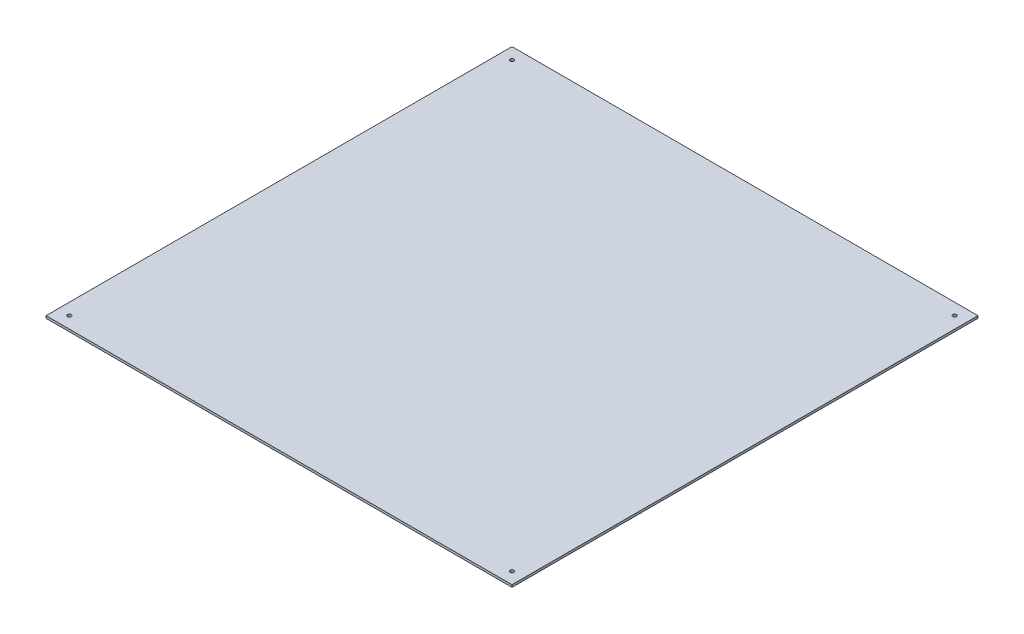
ISO-10303-21;
HEADER;
FILE_DESCRIPTION(('STEP AP214'),'2;1');
FILE_NAME('part.step','',(''),(''),'','','');
FILE_SCHEMA(('AUTOMOTIVE_DESIGN { 1 0 10303 214 1 1 1 1 }'));
ENDSEC;
DATA;
#1=APPLICATION_CONTEXT('core data for automotive mechanical design processes');
#2=APPLICATION_PROTOCOL_DEFINITION('international standard','automotive_design',2000,#1);
#3=PRODUCT_CONTEXT('',#1,'mechanical');
#4=PRODUCT('Part','Part','',(#3));
#5=PRODUCT_RELATED_PRODUCT_CATEGORY('part','',(#4));
#6=PRODUCT_DEFINITION_FORMATION('','',#4);
#7=PRODUCT_DEFINITION_CONTEXT('part definition',#1,'design');
#8=PRODUCT_DEFINITION('design','',#6,#7);
#9=PRODUCT_DEFINITION_SHAPE('','',#8);
#10=(LENGTH_UNIT() NAMED_UNIT(*) SI_UNIT(.MILLI.,.METRE.));
#11=(NAMED_UNIT(*) PLANE_ANGLE_UNIT() SI_UNIT($,.RADIAN.));
#12=(NAMED_UNIT(*) SI_UNIT($,.STERADIAN.) SOLID_ANGLE_UNIT());
#13=UNCERTAINTY_MEASURE_WITH_UNIT(LENGTH_MEASURE(1.E-05),#10,'distance_accuracy_value','');
#14=(GEOMETRIC_REPRESENTATION_CONTEXT(3) GLOBAL_UNCERTAINTY_ASSIGNED_CONTEXT((#13)) GLOBAL_UNIT_ASSIGNED_CONTEXT((#10,
#11,#12)) REPRESENTATION_CONTEXT('',''));
#15=CARTESIAN_POINT('',(0.,0.,0.));
#16=DIRECTION('',(0.,0.,1.));
#17=DIRECTION('',(1.,0.,0.));
#18=AXIS2_PLACEMENT_3D('',#15,#16,#17);
#19=CARTESIAN_POINT('',(-567.961165048544,5.,-366.990291262135));
#20=DIRECTION('',(1.,0.,0.));
#21=DIRECTION('',(0.,0.,-1.));
#22=AXIS2_PLACEMENT_3D('',#19,#20,#21);
#23=PLANE('',#22);
#24=DIRECTION('',(0.,0.,1.));
#25=VECTOR('',#24,1.);
#26=CARTESIAN_POINT('',(-567.961165048544,0.,-366.990291262135));
#27=LINE('',#26,#25);
#28=CARTESIAN_POINT('',(-567.961165048544,0.,-366.990291262135));
#29=VERTEX_POINT('',#28);
#30=CARTESIAN_POINT('',(-567.961165048543,0.,633.009708737865));
#31=VERTEX_POINT('',#30);
#32=EDGE_CURVE('E101',#29,#31,#27,.T.);
#33=ORIENTED_EDGE('',*,*,#32,.T.);
#34=DIRECTION('',(0.,-1.,0.));
#35=VECTOR('',#34,1.);
#36=CARTESIAN_POINT('',(-567.961165048543,5.,633.009708737865));
#37=LINE('',#36,#35);
#38=CARTESIAN_POINT('',(-567.961165048543,5.,633.009708737865));
#39=VERTEX_POINT('',#38);
#40=EDGE_CURVE('E11',#39,#31,#37,.T.);
#41=ORIENTED_EDGE('',*,*,#40,.F.);
#42=DIRECTION('',(0.,0.,1.));
#43=VECTOR('',#42,1.);
#44=CARTESIAN_POINT('',(-567.961165048544,5.,-366.990291262135));
#45=LINE('',#44,#43);
#46=CARTESIAN_POINT('',(-567.961165048544,5.,-366.990291262135));
#47=VERTEX_POINT('',#46);
#48=EDGE_CURVE('E88',#47,#39,#45,.T.);
#49=ORIENTED_EDGE('',*,*,#48,.F.);
#50=DIRECTION('',(0.,-1.,0.));
#51=VECTOR('',#50,1.);
#52=CARTESIAN_POINT('',(-567.961165048544,5.,-366.990291262135));
#53=LINE('',#52,#51);
#54=EDGE_CURVE('E97',#47,#29,#53,.T.);
#55=ORIENTED_EDGE('',*,*,#54,.T.);
#56=EDGE_LOOP('',(#33,#41,#49,#55));
#57=FACE_BOUND('',#56,.T.);
#58=ADVANCED_FACE('F35',(#57),#23,.F.);
#59=CARTESIAN_POINT('',(-567.961165048543,5.,633.009708737865));
#60=DIRECTION('',(0.,0.,-1.));
#61=DIRECTION('',(-1.,0.,0.));
#62=AXIS2_PLACEMENT_3D('',#59,#60,#61);
#63=PLANE('',#62);
#64=DIRECTION('',(1.,0.,0.));
#65=VECTOR('',#64,1.);
#66=CARTESIAN_POINT('',(-567.961165048543,0.,633.009708737865));
#67=LINE('',#66,#65);
#68=CARTESIAN_POINT('',(432.038834951456,0.,633.009708737865));
#69=VERTEX_POINT('',#68);
#70=EDGE_CURVE('E92',#31,#69,#67,.T.);
#71=ORIENTED_EDGE('',*,*,#70,.T.);
#72=DIRECTION('',(0.,-1.,0.));
#73=VECTOR('',#72,1.);
#74=CARTESIAN_POINT('',(432.038834951456,5.,633.009708737865));
#75=LINE('',#74,#73);
#76=CARTESIAN_POINT('',(432.038834951456,5.,633.009708737865));
#77=VERTEX_POINT('',#76);
#78=EDGE_CURVE('E44',#77,#69,#75,.T.);
#79=ORIENTED_EDGE('',*,*,#78,.F.);
#80=DIRECTION('',(1.,0.,0.));
#81=VECTOR('',#80,1.);
#82=CARTESIAN_POINT('',(-567.961165048543,5.,633.009708737865));
#83=LINE('',#82,#81);
#84=EDGE_CURVE('E83',#39,#77,#83,.T.);
#85=ORIENTED_EDGE('',*,*,#84,.F.);
#86=ORIENTED_EDGE('',*,*,#40,.T.);
#87=EDGE_LOOP('',(#71,#79,#85,#86));
#88=FACE_BOUND('',#87,.T.);
#89=ADVANCED_FACE('F91',(#88),#63,.F.);
#90=CARTESIAN_POINT('',(432.038834951456,5.,-366.990291262135));
#91=DIRECTION('',(-1.,0.,0.));
#92=DIRECTION('',(0.,0.,1.));
#93=AXIS2_PLACEMENT_3D('',#90,#91,#92);
#94=PLANE('',#93);
#95=DIRECTION('',(0.,0.,-1.));
#96=VECTOR('',#95,1.);
#97=CARTESIAN_POINT('',(432.038834951456,0.,-366.990291262135));
#98=LINE('',#97,#96);
#99=CARTESIAN_POINT('',(432.038834951456,0.,-366.990291262135));
#100=VERTEX_POINT('',#99);
#101=EDGE_CURVE('E70',#69,#100,#98,.T.);
#102=ORIENTED_EDGE('',*,*,#101,.T.);
#103=DIRECTION('',(0.,-1.,0.));
#104=VECTOR('',#103,1.);
#105=CARTESIAN_POINT('',(432.038834951456,5.,-366.990291262135));
#106=LINE('',#105,#104);
#107=CARTESIAN_POINT('',(432.038834951456,5.,-366.990291262135));
#108=VERTEX_POINT('',#107);
#109=EDGE_CURVE('E93',#108,#100,#106,.T.);
#110=ORIENTED_EDGE('',*,*,#109,.F.);
#111=DIRECTION('',(0.,0.,-1.));
#112=VECTOR('',#111,1.);
#113=CARTESIAN_POINT('',(432.038834951456,5.,-366.990291262135));
#114=LINE('',#113,#112);
#115=EDGE_CURVE('E86',#77,#108,#114,.T.);
#116=ORIENTED_EDGE('',*,*,#115,.F.);
#117=ORIENTED_EDGE('',*,*,#78,.T.);
#118=EDGE_LOOP('',(#102,#110,#116,#117));
#119=FACE_BOUND('',#118,.T.);
#120=ADVANCED_FACE('F95',(#119),#94,.F.);
#121=CARTESIAN_POINT('',(-567.961165048544,5.,-366.990291262135));
#122=DIRECTION('',(0.,0.,1.));
#123=DIRECTION('',(1.,0.,0.));
#124=AXIS2_PLACEMENT_3D('',#121,#122,#123);
#125=PLANE('',#124);
#126=DIRECTION('',(-1.,0.,0.));
#127=VECTOR('',#126,1.);
#128=CARTESIAN_POINT('',(-567.961165048544,0.,-366.990291262135));
#129=LINE('',#128,#127);
#130=EDGE_CURVE('E76',#100,#29,#129,.T.);
#131=ORIENTED_EDGE('',*,*,#130,.T.);
#132=ORIENTED_EDGE('',*,*,#54,.F.);
#133=DIRECTION('',(-1.,0.,0.));
#134=VECTOR('',#133,1.);
#135=CARTESIAN_POINT('',(-567.961165048544,5.,-366.990291262135));
#136=LINE('',#135,#134);
#137=EDGE_CURVE('E53',#108,#47,#136,.T.);
#138=ORIENTED_EDGE('',*,*,#137,.F.);
#139=ORIENTED_EDGE('',*,*,#109,.T.);
#140=EDGE_LOOP('',(#131,#132,#138,#139));
#141=FACE_BOUND('',#140,.T.);
#142=ADVANCED_FACE('F158',(#141),#125,.F.);
#143=CARTESIAN_POINT('',(0.,5.,0.));
#144=DIRECTION('',(0.,1.,0.));
#145=DIRECTION('',(0.,0.,1.));
#146=AXIS2_PLACEMENT_3D('',#143,#144,#145);
#147=PLANE('',#146);
#148=CARTESIAN_POINT('',(407.038834951456,5.,-341.990291262135));
#149=DIRECTION('',(0.,1.,0.));
#150=DIRECTION('',(0.,0.,1.));
#151=AXIS2_PLACEMENT_3D('',#148,#149,#150);
#152=CIRCLE('',#151,4.);
#153=CARTESIAN_POINT('',(407.038834951456,5.,-337.990291262135));
#154=VERTEX_POINT('',#153);
#155=EDGE_CURVE('E126',#154,#154,#152,.T.);
#156=ORIENTED_EDGE('',*,*,#155,.F.);
#157=EDGE_LOOP('',(#156));
#158=FACE_BOUND('',#157,.T.);
#159=CARTESIAN_POINT('',(-542.961165048544,5.,-341.990291262135));
#160=DIRECTION('',(0.,1.,0.));
#161=DIRECTION('',(0.,0.,1.));
#162=AXIS2_PLACEMENT_3D('',#159,#160,#161);
#163=CIRCLE('',#162,4.);
#164=CARTESIAN_POINT('',(-542.961165048544,5.,-337.990291262135));
#165=VERTEX_POINT('',#164);
#166=EDGE_CURVE('E116',#165,#165,#163,.T.);
#167=ORIENTED_EDGE('',*,*,#166,.F.);
#168=EDGE_LOOP('',(#167));
#169=FACE_BOUND('',#168,.T.);
#170=CARTESIAN_POINT('',(-542.961165048544,5.,608.009708737865));
#171=DIRECTION('',(0.,1.,0.));
#172=DIRECTION('',(0.,0.,1.));
#173=AXIS2_PLACEMENT_3D('',#170,#171,#172);
#174=CIRCLE('',#173,4.);
#175=CARTESIAN_POINT('',(-542.961165048544,5.,612.009708737865));
#176=VERTEX_POINT('',#175);
#177=EDGE_CURVE('E113',#176,#176,#174,.T.);
#178=ORIENTED_EDGE('',*,*,#177,.F.);
#179=EDGE_LOOP('',(#178));
#180=FACE_BOUND('',#179,.T.);
#181=CARTESIAN_POINT('',(407.038834951456,5.,608.009708737865));
#182=DIRECTION('',(0.,1.,0.));
#183=DIRECTION('',(0.,0.,1.));
#184=AXIS2_PLACEMENT_3D('',#181,#182,#183);
#185=CIRCLE('',#184,4.);
#186=CARTESIAN_POINT('',(407.038834951456,5.,612.009708737865));
#187=VERTEX_POINT('',#186);
#188=EDGE_CURVE('E112',#187,#187,#185,.T.);
#189=ORIENTED_EDGE('',*,*,#188,.F.);
#190=EDGE_LOOP('',(#189));
#191=FACE_BOUND('',#190,.T.);
#192=ORIENTED_EDGE('',*,*,#48,.T.);
#193=ORIENTED_EDGE('',*,*,#84,.T.);
#194=ORIENTED_EDGE('',*,*,#115,.T.);
#195=ORIENTED_EDGE('',*,*,#137,.T.);
#196=EDGE_LOOP('',(#192,#193,#194,#195));
#197=FACE_BOUND('',#196,.T.);
#198=ADVANCED_FACE('F84',(#158,#169,#180,#191,#197),#147,.T.);
#199=CARTESIAN_POINT('',(0.,0.,0.));
#200=DIRECTION('',(0.,1.,0.));
#201=DIRECTION('',(0.,0.,1.));
#202=AXIS2_PLACEMENT_3D('',#199,#200,#201);
#203=PLANE('',#202);
#204=CARTESIAN_POINT('',(407.038834951456,0.,-341.990291262135));
#205=DIRECTION('',(0.,1.,0.));
#206=DIRECTION('',(0.,0.,1.));
#207=AXIS2_PLACEMENT_3D('',#204,#205,#206);
#208=CIRCLE('',#207,4.);
#209=CARTESIAN_POINT('',(407.038834951456,0.,-337.990291262135));
#210=VERTEX_POINT('',#209);
#211=EDGE_CURVE('E38',#210,#210,#208,.T.);
#212=ORIENTED_EDGE('',*,*,#211,.T.);
#213=EDGE_LOOP('',(#212));
#214=FACE_BOUND('',#213,.T.);
#215=CARTESIAN_POINT('',(-542.961165048544,0.,-341.990291262135));
#216=DIRECTION('',(0.,1.,0.));
#217=DIRECTION('',(0.,0.,1.));
#218=AXIS2_PLACEMENT_3D('',#215,#216,#217);
#219=CIRCLE('',#218,4.);
#220=CARTESIAN_POINT('',(-542.961165048544,0.,-337.990291262135));
#221=VERTEX_POINT('',#220);
#222=EDGE_CURVE('E114',#221,#221,#219,.T.);
#223=ORIENTED_EDGE('',*,*,#222,.T.);
#224=EDGE_LOOP('',(#223));
#225=FACE_BOUND('',#224,.T.);
#226=CARTESIAN_POINT('',(-542.961165048544,0.,608.009708737865));
#227=DIRECTION('',(0.,1.,0.));
#228=DIRECTION('',(0.,0.,1.));
#229=AXIS2_PLACEMENT_3D('',#226,#227,#228);
#230=CIRCLE('',#229,4.);
#231=CARTESIAN_POINT('',(-542.961165048544,0.,612.009708737865));
#232=VERTEX_POINT('',#231);
#233=EDGE_CURVE('E110',#232,#232,#230,.T.);
#234=ORIENTED_EDGE('',*,*,#233,.T.);
#235=EDGE_LOOP('',(#234));
#236=FACE_BOUND('',#235,.T.);
#237=CARTESIAN_POINT('',(407.038834951456,0.,608.009708737865));
#238=DIRECTION('',(0.,1.,0.));
#239=DIRECTION('',(0.,0.,1.));
#240=AXIS2_PLACEMENT_3D('',#237,#238,#239);
#241=CIRCLE('',#240,4.);
#242=CARTESIAN_POINT('',(407.038834951456,0.,612.009708737865));
#243=VERTEX_POINT('',#242);
#244=EDGE_CURVE('E104',#243,#243,#241,.T.);
#245=ORIENTED_EDGE('',*,*,#244,.T.);
#246=EDGE_LOOP('',(#245));
#247=FACE_BOUND('',#246,.T.);
#248=ORIENTED_EDGE('',*,*,#32,.F.);
#249=ORIENTED_EDGE('',*,*,#130,.F.);
#250=ORIENTED_EDGE('',*,*,#101,.F.);
#251=ORIENTED_EDGE('',*,*,#70,.F.);
#252=EDGE_LOOP('',(#248,#249,#250,#251));
#253=FACE_BOUND('',#252,.T.);
#254=ADVANCED_FACE('F134',(#214,#225,#236,#247,#253),#203,.F.);
#255=CARTESIAN_POINT('',(407.038834951456,5.,608.009708737865));
#256=DIRECTION('',(0.,1.,0.));
#257=DIRECTION('',(0.,0.,1.));
#258=AXIS2_PLACEMENT_3D('',#255,#256,#257);
#259=CYLINDRICAL_SURFACE('',#258,4.);
#260=ORIENTED_EDGE('',*,*,#188,.T.);
#261=EDGE_LOOP('',(#260));
#262=FACE_BOUND('',#261,.T.);
#263=ORIENTED_EDGE('',*,*,#244,.F.);
#264=EDGE_LOOP('',(#263));
#265=FACE_BOUND('',#264,.T.);
#266=ADVANCED_FACE('F137',(#262,#265),#259,.F.);
#267=CARTESIAN_POINT('',(-542.961165048544,5.,608.009708737865));
#268=DIRECTION('',(0.,1.,0.));
#269=DIRECTION('',(0.,0.,1.));
#270=AXIS2_PLACEMENT_3D('',#267,#268,#269);
#271=CYLINDRICAL_SURFACE('',#270,4.);
#272=ORIENTED_EDGE('',*,*,#177,.T.);
#273=EDGE_LOOP('',(#272));
#274=FACE_BOUND('',#273,.T.);
#275=ORIENTED_EDGE('',*,*,#233,.F.);
#276=EDGE_LOOP('',(#275));
#277=FACE_BOUND('',#276,.T.);
#278=ADVANCED_FACE('F139',(#274,#277),#271,.F.);
#279=CARTESIAN_POINT('',(-542.961165048544,5.,-341.990291262135));
#280=DIRECTION('',(0.,1.,0.));
#281=DIRECTION('',(0.,0.,1.));
#282=AXIS2_PLACEMENT_3D('',#279,#280,#281);
#283=CYLINDRICAL_SURFACE('',#282,4.);
#284=ORIENTED_EDGE('',*,*,#166,.T.);
#285=EDGE_LOOP('',(#284));
#286=FACE_BOUND('',#285,.T.);
#287=ORIENTED_EDGE('',*,*,#222,.F.);
#288=EDGE_LOOP('',(#287));
#289=FACE_BOUND('',#288,.T.);
#290=ADVANCED_FACE('F146',(#286,#289),#283,.F.);
#291=CARTESIAN_POINT('',(407.038834951456,5.,-341.990291262135));
#292=DIRECTION('',(0.,1.,0.));
#293=DIRECTION('',(0.,0.,1.));
#294=AXIS2_PLACEMENT_3D('',#291,#292,#293);
#295=CYLINDRICAL_SURFACE('',#294,4.);
#296=ORIENTED_EDGE('',*,*,#155,.T.);
#297=EDGE_LOOP('',(#296));
#298=FACE_BOUND('',#297,.T.);
#299=ORIENTED_EDGE('',*,*,#211,.F.);
#300=EDGE_LOOP('',(#299));
#301=FACE_BOUND('',#300,.T.);
#302=ADVANCED_FACE('F212',(#298,#301),#295,.F.);
#303=CLOSED_SHELL('',(#58,#89,#120,#142,#198,#254,#266,#278,#290,#302));
#304=MANIFOLD_SOLID_BREP('B2',#303);
#305=ADVANCED_BREP_SHAPE_REPRESENTATION('',(#18,#304),#14);
#306=SHAPE_DEFINITION_REPRESENTATION(#9,#305);
ENDSEC;
END-ISO-10303-21;
